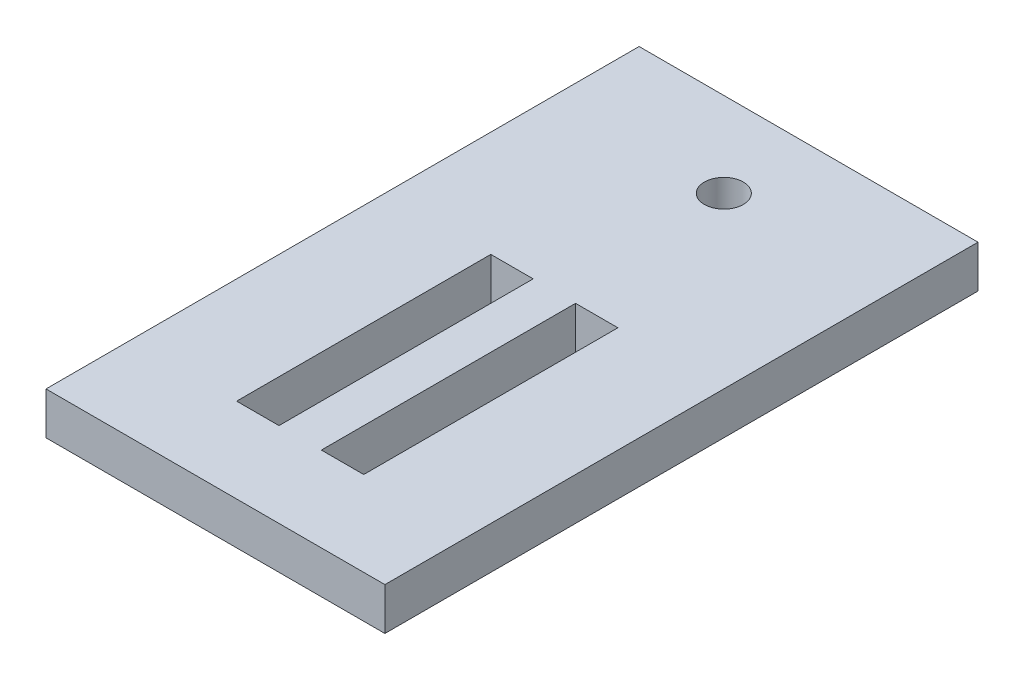
ISO-10303-21;
HEADER;
FILE_DESCRIPTION(('STEP AP214'),'2;1');
FILE_NAME('part.step','',(''),(''),'','','');
FILE_SCHEMA(('AUTOMOTIVE_DESIGN { 1 0 10303 214 1 1 1 1 }'));
ENDSEC;
DATA;
#1=APPLICATION_CONTEXT('core data for automotive mechanical design processes');
#2=APPLICATION_PROTOCOL_DEFINITION('international standard','automotive_design',2000,#1);
#3=PRODUCT_CONTEXT('',#1,'mechanical');
#4=PRODUCT('Part','Part','',(#3));
#5=PRODUCT_RELATED_PRODUCT_CATEGORY('part','',(#4));
#6=PRODUCT_DEFINITION_FORMATION('','',#4);
#7=PRODUCT_DEFINITION_CONTEXT('part definition',#1,'design');
#8=PRODUCT_DEFINITION('design','',#6,#7);
#9=PRODUCT_DEFINITION_SHAPE('','',#8);
#10=(LENGTH_UNIT() NAMED_UNIT(*) SI_UNIT(.MILLI.,.METRE.));
#11=(NAMED_UNIT(*) PLANE_ANGLE_UNIT() SI_UNIT($,.RADIAN.));
#12=(NAMED_UNIT(*) SI_UNIT($,.STERADIAN.) SOLID_ANGLE_UNIT());
#13=UNCERTAINTY_MEASURE_WITH_UNIT(LENGTH_MEASURE(1.E-05),#10,'distance_accuracy_value','');
#14=(GEOMETRIC_REPRESENTATION_CONTEXT(3) GLOBAL_UNCERTAINTY_ASSIGNED_CONTEXT((#13)) GLOBAL_UNIT_ASSIGNED_CONTEXT((#10,
#11,#12)) REPRESENTATION_CONTEXT('',''));
#15=CARTESIAN_POINT('',(0.,0.,0.));
#16=DIRECTION('',(0.,0.,1.));
#17=DIRECTION('',(1.,0.,0.));
#18=AXIS2_PLACEMENT_3D('',#15,#16,#17);
#19=CARTESIAN_POINT('',(0.,3.175,0.));
#20=DIRECTION('',(0.,-1.,0.));
#21=DIRECTION('',(0.,0.,-1.));
#22=AXIS2_PLACEMENT_3D('',#19,#20,#21);
#23=PLANE('',#22);
#24=DIRECTION('',(0.,0.,1.));
#25=VECTOR('',#24,1.);
#26=CARTESIAN_POINT('',(7.9375,3.175,-6.35));
#27=LINE('',#26,#25);
#28=CARTESIAN_POINT('',(7.9375,3.175,-25.4));
#29=VERTEX_POINT('',#28);
#30=CARTESIAN_POINT('',(7.9375,3.175,-6.35));
#31=VERTEX_POINT('',#30);
#32=EDGE_CURVE('E164',#29,#31,#27,.T.);
#33=ORIENTED_EDGE('',*,*,#32,.F.);
#34=DIRECTION('',(-1.,0.,0.));
#35=VECTOR('',#34,1.);
#36=CARTESIAN_POINT('',(7.9375,3.175,-25.4));
#37=LINE('',#36,#35);
#38=CARTESIAN_POINT('',(11.1125,3.175,-25.4));
#39=VERTEX_POINT('',#38);
#40=EDGE_CURVE('E172',#39,#29,#37,.T.);
#41=ORIENTED_EDGE('',*,*,#40,.F.);
#42=DIRECTION('',(0.,0.,-1.));
#43=VECTOR('',#42,1.);
#44=CARTESIAN_POINT('',(11.1125,3.175,-6.35));
#45=LINE('',#44,#43);
#46=CARTESIAN_POINT('',(11.1125,3.175,-6.35));
#47=VERTEX_POINT('',#46);
#48=EDGE_CURVE('E169',#47,#39,#45,.T.);
#49=ORIENTED_EDGE('',*,*,#48,.F.);
#50=DIRECTION('',(1.,0.,0.));
#51=VECTOR('',#50,1.);
#52=CARTESIAN_POINT('',(7.9375,3.175,-6.35));
#53=LINE('',#52,#51);
#54=EDGE_CURVE('E166',#31,#47,#53,.T.);
#55=ORIENTED_EDGE('',*,*,#54,.F.);
#56=EDGE_LOOP('',(#33,#41,#49,#55));
#57=FACE_BOUND('',#56,.T.);
#58=DIRECTION('',(0.,0.,1.));
#59=VECTOR('',#58,1.);
#60=CARTESIAN_POINT('',(0.,3.175,0.));
#61=LINE('',#60,#59);
#62=CARTESIAN_POINT('',(0.,3.175,-44.45));
#63=VERTEX_POINT('',#62);
#64=CARTESIAN_POINT('',(0.,3.175,0.));
#65=VERTEX_POINT('',#64);
#66=EDGE_CURVE('E201',#63,#65,#61,.T.);
#67=ORIENTED_EDGE('',*,*,#66,.T.);
#68=DIRECTION('',(1.,0.,0.));
#69=VECTOR('',#68,1.);
#70=CARTESIAN_POINT('',(0.,3.175,0.));
#71=LINE('',#70,#69);
#72=CARTESIAN_POINT('',(25.4,3.175,0.));
#73=VERTEX_POINT('',#72);
#74=EDGE_CURVE('E204',#65,#73,#71,.T.);
#75=ORIENTED_EDGE('',*,*,#74,.T.);
#76=DIRECTION('',(0.,0.,-1.));
#77=VECTOR('',#76,1.);
#78=CARTESIAN_POINT('',(25.4,3.175,0.));
#79=LINE('',#78,#77);
#80=CARTESIAN_POINT('',(25.4,3.175,-44.45));
#81=VERTEX_POINT('',#80);
#82=EDGE_CURVE('E207',#73,#81,#79,.T.);
#83=ORIENTED_EDGE('',*,*,#82,.T.);
#84=DIRECTION('',(-1.,0.,0.));
#85=VECTOR('',#84,1.);
#86=CARTESIAN_POINT('',(0.,3.175,-44.45));
#87=LINE('',#86,#85);
#88=EDGE_CURVE('E209',#81,#63,#87,.T.);
#89=ORIENTED_EDGE('',*,*,#88,.T.);
#90=EDGE_LOOP('',(#67,#75,#83,#89));
#91=FACE_BOUND('',#90,.T.);
#92=CARTESIAN_POINT('',(12.7,3.175,-38.1));
#93=DIRECTION('',(0.,1.,0.));
#94=DIRECTION('',(0.,0.,1.));
#95=AXIS2_PLACEMENT_3D('',#92,#93,#94);
#96=CIRCLE('',#95,1.4605);
#97=CARTESIAN_POINT('',(12.7,3.175,-36.6395));
#98=VERTEX_POINT('',#97);
#99=EDGE_CURVE('E195',#98,#98,#96,.T.);
#100=ORIENTED_EDGE('',*,*,#99,.F.);
#101=EDGE_LOOP('',(#100));
#102=FACE_BOUND('',#101,.T.);
#103=DIRECTION('',(0.,0.,1.));
#104=VECTOR('',#103,1.);
#105=CARTESIAN_POINT('',(14.2875,3.175,-6.35));
#106=LINE('',#105,#104);
#107=CARTESIAN_POINT('',(14.2875,3.175,-25.4));
#108=VERTEX_POINT('',#107);
#109=CARTESIAN_POINT('',(14.2875,3.175,-6.35));
#110=VERTEX_POINT('',#109);
#111=EDGE_CURVE('E128',#108,#110,#106,.T.);
#112=ORIENTED_EDGE('',*,*,#111,.F.);
#113=DIRECTION('',(-1.,0.,0.));
#114=VECTOR('',#113,1.);
#115=CARTESIAN_POINT('',(14.2875,3.175,-25.4));
#116=LINE('',#115,#114);
#117=CARTESIAN_POINT('',(17.4625,3.175,-25.4));
#118=VERTEX_POINT('',#117);
#119=EDGE_CURVE('E150',#118,#108,#116,.T.);
#120=ORIENTED_EDGE('',*,*,#119,.F.);
#121=DIRECTION('',(0.,0.,-1.));
#122=VECTOR('',#121,1.);
#123=CARTESIAN_POINT('',(17.4625,3.175,-6.35));
#124=LINE('',#123,#122);
#125=CARTESIAN_POINT('',(17.4625,3.175,-6.35));
#126=VERTEX_POINT('',#125);
#127=EDGE_CURVE('E148',#126,#118,#124,.T.);
#128=ORIENTED_EDGE('',*,*,#127,.F.);
#129=DIRECTION('',(1.,0.,0.));
#130=VECTOR('',#129,1.);
#131=CARTESIAN_POINT('',(14.2875,3.175,-6.35));
#132=LINE('',#131,#130);
#133=EDGE_CURVE('E136',#110,#126,#132,.T.);
#134=ORIENTED_EDGE('',*,*,#133,.F.);
#135=EDGE_LOOP('',(#112,#120,#128,#134));
#136=FACE_BOUND('',#135,.T.);
#137=ADVANCED_FACE('F39',(#57,#91,#102,#136),#23,.F.);
#138=CARTESIAN_POINT('',(0.,0.,0.));
#139=DIRECTION('',(0.,-1.,0.));
#140=DIRECTION('',(0.,0.,-1.));
#141=AXIS2_PLACEMENT_3D('',#138,#139,#140);
#142=PLANE('',#141);
#143=DIRECTION('',(0.,0.,1.));
#144=VECTOR('',#143,1.);
#145=CARTESIAN_POINT('',(0.,0.,0.));
#146=LINE('',#145,#144);
#147=CARTESIAN_POINT('',(0.,0.,-44.45));
#148=VERTEX_POINT('',#147);
#149=CARTESIAN_POINT('',(0.,0.,0.));
#150=VERTEX_POINT('',#149);
#151=EDGE_CURVE('E198',#148,#150,#146,.T.);
#152=ORIENTED_EDGE('',*,*,#151,.F.);
#153=DIRECTION('',(-1.,0.,0.));
#154=VECTOR('',#153,1.);
#155=CARTESIAN_POINT('',(0.,0.,-44.45));
#156=LINE('',#155,#154);
#157=CARTESIAN_POINT('',(25.4,0.,-44.45));
#158=VERTEX_POINT('',#157);
#159=EDGE_CURVE('E205',#158,#148,#156,.T.);
#160=ORIENTED_EDGE('',*,*,#159,.F.);
#161=DIRECTION('',(0.,0.,-1.));
#162=VECTOR('',#161,1.);
#163=CARTESIAN_POINT('',(25.4,0.,0.));
#164=LINE('',#163,#162);
#165=CARTESIAN_POINT('',(25.4,0.,0.));
#166=VERTEX_POINT('',#165);
#167=EDGE_CURVE('E216',#166,#158,#164,.T.);
#168=ORIENTED_EDGE('',*,*,#167,.F.);
#169=DIRECTION('',(1.,0.,0.));
#170=VECTOR('',#169,1.);
#171=CARTESIAN_POINT('',(0.,0.,0.));
#172=LINE('',#171,#170);
#173=EDGE_CURVE('E214',#150,#166,#172,.T.);
#174=ORIENTED_EDGE('',*,*,#173,.F.);
#175=EDGE_LOOP('',(#152,#160,#168,#174));
#176=FACE_BOUND('',#175,.T.);
#177=CARTESIAN_POINT('',(12.7,0.,-38.1));
#178=DIRECTION('',(0.,1.,0.));
#179=DIRECTION('',(0.,0.,1.));
#180=AXIS2_PLACEMENT_3D('',#177,#178,#179);
#181=CIRCLE('',#180,1.4605);
#182=CARTESIAN_POINT('',(12.7,0.,-36.6395));
#183=VERTEX_POINT('',#182);
#184=EDGE_CURVE('E194',#183,#183,#181,.T.);
#185=ORIENTED_EDGE('',*,*,#184,.T.);
#186=EDGE_LOOP('',(#185));
#187=FACE_BOUND('',#186,.T.);
#188=DIRECTION('',(-1.,0.,0.));
#189=VECTOR('',#188,1.);
#190=CARTESIAN_POINT('',(7.9375,0.,-25.4));
#191=LINE('',#190,#189);
#192=CARTESIAN_POINT('',(11.1125,0.,-25.4));
#193=VERTEX_POINT('',#192);
#194=CARTESIAN_POINT('',(7.9375,0.,-25.4));
#195=VERTEX_POINT('',#194);
#196=EDGE_CURVE('E167',#193,#195,#191,.T.);
#197=ORIENTED_EDGE('',*,*,#196,.T.);
#198=DIRECTION('',(0.,0.,1.));
#199=VECTOR('',#198,1.);
#200=CARTESIAN_POINT('',(7.9375,0.,-6.35));
#201=LINE('',#200,#199);
#202=CARTESIAN_POINT('',(7.9375,0.,-6.35));
#203=VERTEX_POINT('',#202);
#204=EDGE_CURVE('E144',#195,#203,#201,.T.);
#205=ORIENTED_EDGE('',*,*,#204,.T.);
#206=DIRECTION('',(1.,0.,0.));
#207=VECTOR('',#206,1.);
#208=CARTESIAN_POINT('',(7.9375,0.,-6.35));
#209=LINE('',#208,#207);
#210=CARTESIAN_POINT('',(11.1125,0.,-6.35));
#211=VERTEX_POINT('',#210);
#212=EDGE_CURVE('E177',#203,#211,#209,.T.);
#213=ORIENTED_EDGE('',*,*,#212,.T.);
#214=DIRECTION('',(0.,0.,-1.));
#215=VECTOR('',#214,1.);
#216=CARTESIAN_POINT('',(11.1125,0.,-6.35));
#217=LINE('',#216,#215);
#218=EDGE_CURVE('E180',#211,#193,#217,.T.);
#219=ORIENTED_EDGE('',*,*,#218,.T.);
#220=EDGE_LOOP('',(#197,#205,#213,#219));
#221=FACE_BOUND('',#220,.T.);
#222=DIRECTION('',(-1.,0.,0.));
#223=VECTOR('',#222,1.);
#224=CARTESIAN_POINT('',(14.2875,0.,-25.4));
#225=LINE('',#224,#223);
#226=CARTESIAN_POINT('',(17.4625,0.,-25.4));
#227=VERTEX_POINT('',#226);
#228=CARTESIAN_POINT('',(14.2875,0.,-25.4));
#229=VERTEX_POINT('',#228);
#230=EDGE_CURVE('E137',#227,#229,#225,.T.);
#231=ORIENTED_EDGE('',*,*,#230,.T.);
#232=DIRECTION('',(0.,0.,1.));
#233=VECTOR('',#232,1.);
#234=CARTESIAN_POINT('',(14.2875,0.,-6.35));
#235=LINE('',#234,#233);
#236=CARTESIAN_POINT('',(14.2875,0.,-6.35));
#237=VERTEX_POINT('',#236);
#238=EDGE_CURVE('E62',#229,#237,#235,.T.);
#239=ORIENTED_EDGE('',*,*,#238,.T.);
#240=DIRECTION('',(1.,0.,0.));
#241=VECTOR('',#240,1.);
#242=CARTESIAN_POINT('',(14.2875,0.,-6.35));
#243=LINE('',#242,#241);
#244=CARTESIAN_POINT('',(17.4625,0.,-6.35));
#245=VERTEX_POINT('',#244);
#246=EDGE_CURVE('E143',#237,#245,#243,.T.);
#247=ORIENTED_EDGE('',*,*,#246,.T.);
#248=DIRECTION('',(0.,0.,-1.));
#249=VECTOR('',#248,1.);
#250=CARTESIAN_POINT('',(17.4625,0.,-6.35));
#251=LINE('',#250,#249);
#252=EDGE_CURVE('E156',#245,#227,#251,.T.);
#253=ORIENTED_EDGE('',*,*,#252,.T.);
#254=EDGE_LOOP('',(#231,#239,#247,#253));
#255=FACE_BOUND('',#254,.T.);
#256=ADVANCED_FACE('F234',(#176,#187,#221,#255),#142,.T.);
#257=CARTESIAN_POINT('',(0.,3.175,0.));
#258=DIRECTION('',(1.,0.,0.));
#259=DIRECTION('',(0.,0.,-1.));
#260=AXIS2_PLACEMENT_3D('',#257,#258,#259);
#261=PLANE('',#260);
#262=ORIENTED_EDGE('',*,*,#151,.T.);
#263=DIRECTION('',(0.,-1.,0.));
#264=VECTOR('',#263,1.);
#265=CARTESIAN_POINT('',(0.,3.175,0.));
#266=LINE('',#265,#264);
#267=EDGE_CURVE('E11',#65,#150,#266,.T.);
#268=ORIENTED_EDGE('',*,*,#267,.F.);
#269=ORIENTED_EDGE('',*,*,#66,.F.);
#270=DIRECTION('',(0.,-1.,0.));
#271=VECTOR('',#270,1.);
#272=CARTESIAN_POINT('',(0.,3.175,-44.45));
#273=LINE('',#272,#271);
#274=EDGE_CURVE('E211',#63,#148,#273,.T.);
#275=ORIENTED_EDGE('',*,*,#274,.T.);
#276=EDGE_LOOP('',(#262,#268,#269,#275));
#277=FACE_BOUND('',#276,.T.);
#278=ADVANCED_FACE('F41',(#277),#261,.F.);
#279=CARTESIAN_POINT('',(0.,3.175,0.));
#280=DIRECTION('',(0.,0.,-1.));
#281=DIRECTION('',(-1.,0.,0.));
#282=AXIS2_PLACEMENT_3D('',#279,#280,#281);
#283=PLANE('',#282);
#284=ORIENTED_EDGE('',*,*,#173,.T.);
#285=DIRECTION('',(0.,-1.,0.));
#286=VECTOR('',#285,1.);
#287=CARTESIAN_POINT('',(25.4,3.175,0.));
#288=LINE('',#287,#286);
#289=EDGE_CURVE('E47',#73,#166,#288,.T.);
#290=ORIENTED_EDGE('',*,*,#289,.F.);
#291=ORIENTED_EDGE('',*,*,#74,.F.);
#292=ORIENTED_EDGE('',*,*,#267,.T.);
#293=EDGE_LOOP('',(#284,#290,#291,#292));
#294=FACE_BOUND('',#293,.T.);
#295=ADVANCED_FACE('F245',(#294),#283,.F.);
#296=CARTESIAN_POINT('',(25.4,3.175,0.));
#297=DIRECTION('',(-1.,0.,0.));
#298=DIRECTION('',(0.,0.,1.));
#299=AXIS2_PLACEMENT_3D('',#296,#297,#298);
#300=PLANE('',#299);
#301=ORIENTED_EDGE('',*,*,#167,.T.);
#302=DIRECTION('',(0.,-1.,0.));
#303=VECTOR('',#302,1.);
#304=CARTESIAN_POINT('',(25.4,3.175,-44.45));
#305=LINE('',#304,#303);
#306=EDGE_CURVE('E221',#81,#158,#305,.T.);
#307=ORIENTED_EDGE('',*,*,#306,.F.);
#308=ORIENTED_EDGE('',*,*,#82,.F.);
#309=ORIENTED_EDGE('',*,*,#289,.T.);
#310=EDGE_LOOP('',(#301,#307,#308,#309));
#311=FACE_BOUND('',#310,.T.);
#312=ADVANCED_FACE('F228',(#311),#300,.F.);
#313=CARTESIAN_POINT('',(0.,3.175,-44.45));
#314=DIRECTION('',(0.,0.,1.));
#315=DIRECTION('',(1.,0.,0.));
#316=AXIS2_PLACEMENT_3D('',#313,#314,#315);
#317=PLANE('',#316);
#318=ORIENTED_EDGE('',*,*,#159,.T.);
#319=ORIENTED_EDGE('',*,*,#274,.F.);
#320=ORIENTED_EDGE('',*,*,#88,.F.);
#321=ORIENTED_EDGE('',*,*,#306,.T.);
#322=EDGE_LOOP('',(#318,#319,#320,#321));
#323=FACE_BOUND('',#322,.T.);
#324=ADVANCED_FACE('F238',(#323),#317,.F.);
#325=CARTESIAN_POINT('',(12.7,3.175,-38.1));
#326=DIRECTION('',(0.,-1.,0.));
#327=DIRECTION('',(0.,0.,-1.));
#328=AXIS2_PLACEMENT_3D('',#325,#326,#327);
#329=CYLINDRICAL_SURFACE('',#328,1.4605);
#330=ORIENTED_EDGE('',*,*,#99,.T.);
#331=EDGE_LOOP('',(#330));
#332=FACE_BOUND('',#331,.T.);
#333=ORIENTED_EDGE('',*,*,#184,.F.);
#334=EDGE_LOOP('',(#333));
#335=FACE_BOUND('',#334,.T.);
#336=ADVANCED_FACE('F261',(#332,#335),#329,.F.);
#337=CARTESIAN_POINT('',(7.9375,3.175,-6.35));
#338=DIRECTION('',(1.,0.,0.));
#339=DIRECTION('',(0.,0.,-1.));
#340=AXIS2_PLACEMENT_3D('',#337,#338,#339);
#341=PLANE('',#340);
#342=ORIENTED_EDGE('',*,*,#204,.F.);
#343=DIRECTION('',(0.,-1.,0.));
#344=VECTOR('',#343,1.);
#345=CARTESIAN_POINT('',(7.9375,3.175,-25.4));
#346=LINE('',#345,#344);
#347=EDGE_CURVE('E174',#29,#195,#346,.T.);
#348=ORIENTED_EDGE('',*,*,#347,.F.);
#349=ORIENTED_EDGE('',*,*,#32,.T.);
#350=DIRECTION('',(0.,-1.,0.));
#351=VECTOR('',#350,1.);
#352=CARTESIAN_POINT('',(7.9375,3.175,-6.35));
#353=LINE('',#352,#351);
#354=EDGE_CURVE('E191',#31,#203,#353,.T.);
#355=ORIENTED_EDGE('',*,*,#354,.T.);
#356=EDGE_LOOP('',(#342,#348,#349,#355));
#357=FACE_BOUND('',#356,.T.);
#358=ADVANCED_FACE('F268',(#357),#341,.T.);
#359=CARTESIAN_POINT('',(7.9375,3.175,-6.35));
#360=DIRECTION('',(0.,0.,-1.));
#361=DIRECTION('',(-1.,0.,0.));
#362=AXIS2_PLACEMENT_3D('',#359,#360,#361);
#363=PLANE('',#362);
#364=ORIENTED_EDGE('',*,*,#212,.F.);
#365=ORIENTED_EDGE('',*,*,#354,.F.);
#366=ORIENTED_EDGE('',*,*,#54,.T.);
#367=DIRECTION('',(0.,-1.,0.));
#368=VECTOR('',#367,1.);
#369=CARTESIAN_POINT('',(11.1125,3.175,-6.35));
#370=LINE('',#369,#368);
#371=EDGE_CURVE('E189',#47,#211,#370,.T.);
#372=ORIENTED_EDGE('',*,*,#371,.T.);
#373=EDGE_LOOP('',(#364,#365,#366,#372));
#374=FACE_BOUND('',#373,.T.);
#375=ADVANCED_FACE('F273',(#374),#363,.T.);
#376=CARTESIAN_POINT('',(11.1125,3.175,-6.35));
#377=DIRECTION('',(-1.,0.,0.));
#378=DIRECTION('',(0.,0.,1.));
#379=AXIS2_PLACEMENT_3D('',#376,#377,#378);
#380=PLANE('',#379);
#381=ORIENTED_EDGE('',*,*,#218,.F.);
#382=ORIENTED_EDGE('',*,*,#371,.F.);
#383=ORIENTED_EDGE('',*,*,#48,.T.);
#384=DIRECTION('',(0.,-1.,0.));
#385=VECTOR('',#384,1.);
#386=CARTESIAN_POINT('',(11.1125,3.175,-25.4));
#387=LINE('',#386,#385);
#388=EDGE_CURVE('E187',#39,#193,#387,.T.);
#389=ORIENTED_EDGE('',*,*,#388,.T.);
#390=EDGE_LOOP('',(#381,#382,#383,#389));
#391=FACE_BOUND('',#390,.T.);
#392=ADVANCED_FACE('F299',(#391),#380,.T.);
#393=CARTESIAN_POINT('',(7.9375,3.175,-25.4));
#394=DIRECTION('',(0.,0.,1.));
#395=DIRECTION('',(1.,0.,0.));
#396=AXIS2_PLACEMENT_3D('',#393,#394,#395);
#397=PLANE('',#396);
#398=ORIENTED_EDGE('',*,*,#196,.F.);
#399=ORIENTED_EDGE('',*,*,#388,.F.);
#400=ORIENTED_EDGE('',*,*,#40,.T.);
#401=ORIENTED_EDGE('',*,*,#347,.T.);
#402=EDGE_LOOP('',(#398,#399,#400,#401));
#403=FACE_BOUND('',#402,.T.);
#404=ADVANCED_FACE('F296',(#403),#397,.T.);
#405=CARTESIAN_POINT('',(14.2875,3.175,-6.35));
#406=DIRECTION('',(1.,0.,0.));
#407=DIRECTION('',(0.,0.,-1.));
#408=AXIS2_PLACEMENT_3D('',#405,#406,#407);
#409=PLANE('',#408);
#410=ORIENTED_EDGE('',*,*,#238,.F.);
#411=DIRECTION('',(0.,-1.,0.));
#412=VECTOR('',#411,1.);
#413=CARTESIAN_POINT('',(14.2875,3.175,-25.4));
#414=LINE('',#413,#412);
#415=EDGE_CURVE('E132',#108,#229,#414,.T.);
#416=ORIENTED_EDGE('',*,*,#415,.F.);
#417=ORIENTED_EDGE('',*,*,#111,.T.);
#418=DIRECTION('',(0.,-1.,0.));
#419=VECTOR('',#418,1.);
#420=CARTESIAN_POINT('',(14.2875,3.175,-6.35));
#421=LINE('',#420,#419);
#422=EDGE_CURVE('E131',#110,#237,#421,.T.);
#423=ORIENTED_EDGE('',*,*,#422,.T.);
#424=EDGE_LOOP('',(#410,#416,#417,#423));
#425=FACE_BOUND('',#424,.T.);
#426=ADVANCED_FACE('F130',(#425),#409,.T.);
#427=CARTESIAN_POINT('',(14.2875,3.175,-6.35));
#428=DIRECTION('',(0.,0.,-1.));
#429=DIRECTION('',(-1.,0.,0.));
#430=AXIS2_PLACEMENT_3D('',#427,#428,#429);
#431=PLANE('',#430);
#432=ORIENTED_EDGE('',*,*,#246,.F.);
#433=ORIENTED_EDGE('',*,*,#422,.F.);
#434=ORIENTED_EDGE('',*,*,#133,.T.);
#435=DIRECTION('',(0.,-1.,0.));
#436=VECTOR('',#435,1.);
#437=CARTESIAN_POINT('',(17.4625,3.175,-6.35));
#438=LINE('',#437,#436);
#439=EDGE_CURVE('E145',#126,#245,#438,.T.);
#440=ORIENTED_EDGE('',*,*,#439,.T.);
#441=EDGE_LOOP('',(#432,#433,#434,#440));
#442=FACE_BOUND('',#441,.T.);
#443=ADVANCED_FACE('F140',(#442),#431,.T.);
#444=CARTESIAN_POINT('',(17.4625,3.175,-6.35));
#445=DIRECTION('',(-1.,0.,0.));
#446=DIRECTION('',(0.,0.,1.));
#447=AXIS2_PLACEMENT_3D('',#444,#445,#446);
#448=PLANE('',#447);
#449=ORIENTED_EDGE('',*,*,#252,.F.);
#450=ORIENTED_EDGE('',*,*,#439,.F.);
#451=ORIENTED_EDGE('',*,*,#127,.T.);
#452=DIRECTION('',(0.,-1.,0.));
#453=VECTOR('',#452,1.);
#454=CARTESIAN_POINT('',(17.4625,3.175,-25.4));
#455=LINE('',#454,#453);
#456=EDGE_CURVE('E54',#118,#227,#455,.T.);
#457=ORIENTED_EDGE('',*,*,#456,.T.);
#458=EDGE_LOOP('',(#449,#450,#451,#457));
#459=FACE_BOUND('',#458,.T.);
#460=ADVANCED_FACE('F284',(#459),#448,.T.);
#461=CARTESIAN_POINT('',(14.2875,3.175,-25.4));
#462=DIRECTION('',(0.,0.,1.));
#463=DIRECTION('',(1.,0.,0.));
#464=AXIS2_PLACEMENT_3D('',#461,#462,#463);
#465=PLANE('',#464);
#466=ORIENTED_EDGE('',*,*,#230,.F.);
#467=ORIENTED_EDGE('',*,*,#456,.F.);
#468=ORIENTED_EDGE('',*,*,#119,.T.);
#469=ORIENTED_EDGE('',*,*,#415,.T.);
#470=EDGE_LOOP('',(#466,#467,#468,#469));
#471=FACE_BOUND('',#470,.T.);
#472=ADVANCED_FACE('F282',(#471),#465,.T.);
#473=CLOSED_SHELL('',(#137,#256,#278,#295,#312,#324,#336,#358,#375,#392,#404,#426,#443,#460,#472));
#474=MANIFOLD_SOLID_BREP('B2',#473);
#475=ADVANCED_BREP_SHAPE_REPRESENTATION('',(#18,#474),#14);
#476=SHAPE_DEFINITION_REPRESENTATION(#9,#475);
ENDSEC;
END-ISO-10303-21;
